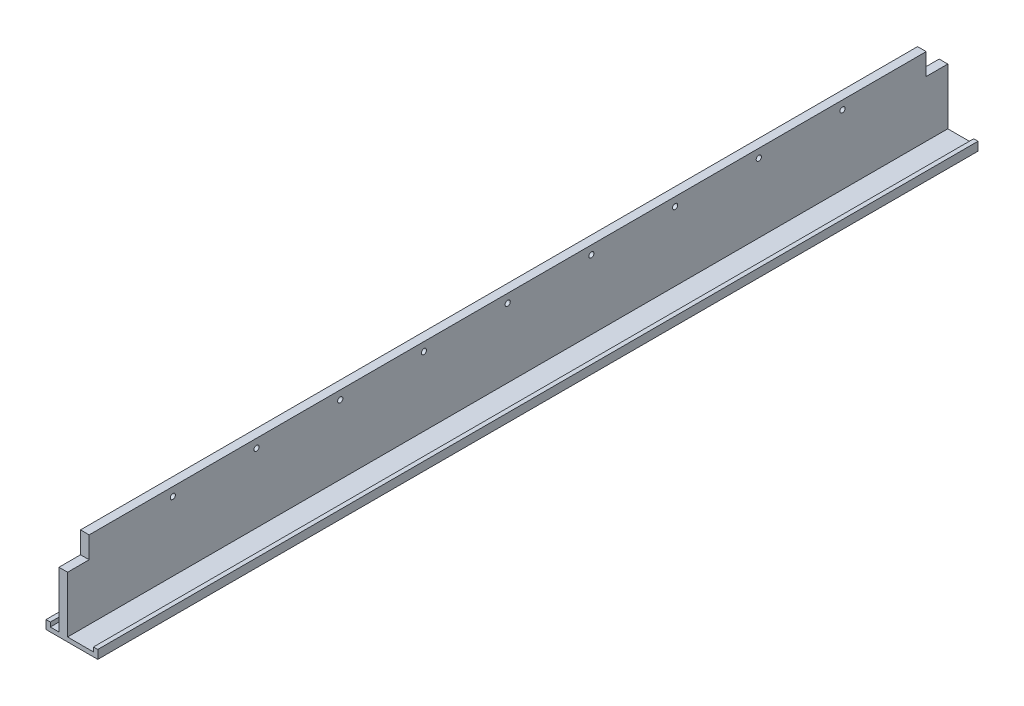
ISO-10303-21;
HEADER;
FILE_DESCRIPTION(('STEP AP214'),'2;1');
FILE_NAME('part.step','',(''),(''),'','','');
FILE_SCHEMA(('AUTOMOTIVE_DESIGN { 1 0 10303 214 1 1 1 1 }'));
ENDSEC;
DATA;
#1=APPLICATION_CONTEXT('core data for automotive mechanical design processes');
#2=APPLICATION_PROTOCOL_DEFINITION('international standard','automotive_design',2000,#1);
#3=PRODUCT_CONTEXT('',#1,'mechanical');
#4=PRODUCT('Part','Part','',(#3));
#5=PRODUCT_RELATED_PRODUCT_CATEGORY('part','',(#4));
#6=PRODUCT_DEFINITION_FORMATION('','',#4);
#7=PRODUCT_DEFINITION_CONTEXT('part definition',#1,'design');
#8=PRODUCT_DEFINITION('design','',#6,#7);
#9=PRODUCT_DEFINITION_SHAPE('','',#8);
#10=(LENGTH_UNIT() NAMED_UNIT(*) SI_UNIT(.MILLI.,.METRE.));
#11=(NAMED_UNIT(*) PLANE_ANGLE_UNIT() SI_UNIT($,.RADIAN.));
#12=(NAMED_UNIT(*) SI_UNIT($,.STERADIAN.) SOLID_ANGLE_UNIT());
#13=UNCERTAINTY_MEASURE_WITH_UNIT(LENGTH_MEASURE(1.E-05),#10,'distance_accuracy_value','');
#14=(GEOMETRIC_REPRESENTATION_CONTEXT(3) GLOBAL_UNCERTAINTY_ASSIGNED_CONTEXT((#13)) GLOBAL_UNIT_ASSIGNED_CONTEXT((#10,
#11,#12)) REPRESENTATION_CONTEXT('',''));
#15=CARTESIAN_POINT('',(0.,0.,0.));
#16=DIRECTION('',(0.,0.,1.));
#17=DIRECTION('',(1.,0.,0.));
#18=AXIS2_PLACEMENT_3D('',#15,#16,#17);
#19=CARTESIAN_POINT('',(5.,10.,1020.));
#20=DIRECTION('',(0.,-1.,0.));
#21=DIRECTION('',(1.,0.,0.));
#22=AXIS2_PLACEMENT_3D('',#19,#20,#21);
#23=PLANE('',#22);
#24=DIRECTION('',(-1.,0.,0.));
#25=VECTOR('',#24,1.);
#26=CARTESIAN_POINT('',(5.,10.,0.));
#27=LINE('',#26,#25);
#28=CARTESIAN_POINT('',(5.,10.,0.));
#29=VERTEX_POINT('',#28);
#30=CARTESIAN_POINT('',(0.,10.,0.));
#31=VERTEX_POINT('',#30);
#32=EDGE_CURVE('E376',#29,#31,#27,.T.);
#33=ORIENTED_EDGE('',*,*,#32,.T.);
#34=DIRECTION('',(0.,0.,-1.));
#35=VECTOR('',#34,1.);
#36=CARTESIAN_POINT('',(0.,10.,1020.));
#37=LINE('',#36,#35);
#38=CARTESIAN_POINT('',(0.,10.,1020.));
#39=VERTEX_POINT('',#38);
#40=EDGE_CURVE('E197',#39,#31,#37,.T.);
#41=ORIENTED_EDGE('',*,*,#40,.F.);
#42=DIRECTION('',(-1.,0.,0.));
#43=VECTOR('',#42,1.);
#44=CARTESIAN_POINT('',(5.,10.,1020.));
#45=LINE('',#44,#43);
#46=CARTESIAN_POINT('',(5.,10.,1020.));
#47=VERTEX_POINT('',#46);
#48=EDGE_CURVE('E380',#47,#39,#45,.T.);
#49=ORIENTED_EDGE('',*,*,#48,.F.);
#50=DIRECTION('',(0.,0.,-1.));
#51=VECTOR('',#50,1.);
#52=CARTESIAN_POINT('',(5.,10.,1020.));
#53=LINE('',#52,#51);
#54=EDGE_CURVE('E405',#47,#29,#53,.T.);
#55=ORIENTED_EDGE('',*,*,#54,.T.);
#56=EDGE_LOOP('',(#33,#41,#49,#55));
#57=FACE_BOUND('',#56,.T.);
#58=ADVANCED_FACE('F32',(#57),#23,.F.);
#59=CARTESIAN_POINT('',(0.,10.,1020.));
#60=DIRECTION('',(1.,0.,0.));
#61=DIRECTION('',(0.,1.,0.));
#62=AXIS2_PLACEMENT_3D('',#59,#60,#61);
#63=PLANE('',#62);
#64=DIRECTION('',(0.,-1.,0.));
#65=VECTOR('',#64,1.);
#66=CARTESIAN_POINT('',(0.,10.,0.));
#67=LINE('',#66,#65);
#68=CARTESIAN_POINT('',(0.,0.,0.));
#69=VERTEX_POINT('',#68);
#70=EDGE_CURVE('E407',#31,#69,#67,.T.);
#71=ORIENTED_EDGE('',*,*,#70,.T.);
#72=DIRECTION('',(0.,0.,-1.));
#73=VECTOR('',#72,1.);
#74=CARTESIAN_POINT('',(0.,0.,1020.));
#75=LINE('',#74,#73);
#76=CARTESIAN_POINT('',(0.,0.,1020.));
#77=VERTEX_POINT('',#76);
#78=EDGE_CURVE('E194',#77,#69,#75,.T.);
#79=ORIENTED_EDGE('',*,*,#78,.F.);
#80=DIRECTION('',(0.,-1.,0.));
#81=VECTOR('',#80,1.);
#82=CARTESIAN_POINT('',(0.,10.,1020.));
#83=LINE('',#82,#81);
#84=EDGE_CURVE('E383',#39,#77,#83,.T.);
#85=ORIENTED_EDGE('',*,*,#84,.F.);
#86=ORIENTED_EDGE('',*,*,#40,.T.);
#87=EDGE_LOOP('',(#71,#79,#85,#86));
#88=FACE_BOUND('',#87,.T.);
#89=ADVANCED_FACE('F260',(#88),#63,.F.);
#90=CARTESIAN_POINT('',(0.,0.,1020.));
#91=DIRECTION('',(0.,1.,0.));
#92=DIRECTION('',(0.,0.,1.));
#93=AXIS2_PLACEMENT_3D('',#90,#91,#92);
#94=PLANE('',#93);
#95=DIRECTION('',(1.,0.,0.));
#96=VECTOR('',#95,1.);
#97=CARTESIAN_POINT('',(0.,0.,0.));
#98=LINE('',#97,#96);
#99=CARTESIAN_POINT('',(60.,0.,0.));
#100=VERTEX_POINT('',#99);
#101=EDGE_CURVE('E409',#69,#100,#98,.T.);
#102=ORIENTED_EDGE('',*,*,#101,.T.);
#103=DIRECTION('',(0.,0.,-1.));
#104=VECTOR('',#103,1.);
#105=CARTESIAN_POINT('',(60.,0.,1020.));
#106=LINE('',#105,#104);
#107=CARTESIAN_POINT('',(60.,0.,1020.));
#108=VERTEX_POINT('',#107);
#109=EDGE_CURVE('E191',#108,#100,#106,.T.);
#110=ORIENTED_EDGE('',*,*,#109,.F.);
#111=DIRECTION('',(1.,0.,0.));
#112=VECTOR('',#111,1.);
#113=CARTESIAN_POINT('',(0.,0.,1020.));
#114=LINE('',#113,#112);
#115=EDGE_CURVE('E386',#77,#108,#114,.T.);
#116=ORIENTED_EDGE('',*,*,#115,.F.);
#117=ORIENTED_EDGE('',*,*,#78,.T.);
#118=EDGE_LOOP('',(#102,#110,#116,#117));
#119=FACE_BOUND('',#118,.T.);
#120=ADVANCED_FACE('F266',(#119),#94,.F.);
#121=CARTESIAN_POINT('',(60.,0.,1020.));
#122=DIRECTION('',(-1.,0.,0.));
#123=DIRECTION('',(0.,0.,1.));
#124=AXIS2_PLACEMENT_3D('',#121,#122,#123);
#125=PLANE('',#124);
#126=DIRECTION('',(0.,1.,0.));
#127=VECTOR('',#126,1.);
#128=CARTESIAN_POINT('',(60.,0.,0.));
#129=LINE('',#128,#127);
#130=CARTESIAN_POINT('',(60.,10.,0.));
#131=VERTEX_POINT('',#130);
#132=EDGE_CURVE('E411',#100,#131,#129,.T.);
#133=ORIENTED_EDGE('',*,*,#132,.T.);
#134=DIRECTION('',(0.,0.,-1.));
#135=VECTOR('',#134,1.);
#136=CARTESIAN_POINT('',(60.,10.,1020.));
#137=LINE('',#136,#135);
#138=CARTESIAN_POINT('',(60.,10.,1020.));
#139=VERTEX_POINT('',#138);
#140=EDGE_CURVE('E188',#139,#131,#137,.T.);
#141=ORIENTED_EDGE('',*,*,#140,.F.);
#142=DIRECTION('',(0.,1.,0.));
#143=VECTOR('',#142,1.);
#144=CARTESIAN_POINT('',(60.,0.,1020.));
#145=LINE('',#144,#143);
#146=EDGE_CURVE('E388',#108,#139,#145,.T.);
#147=ORIENTED_EDGE('',*,*,#146,.F.);
#148=ORIENTED_EDGE('',*,*,#109,.T.);
#149=EDGE_LOOP('',(#133,#141,#147,#148));
#150=FACE_BOUND('',#149,.T.);
#151=ADVANCED_FACE('F464',(#150),#125,.F.);
#152=CARTESIAN_POINT('',(60.,10.,1020.));
#153=DIRECTION('',(0.,-1.,0.));
#154=DIRECTION('',(0.,0.,-1.));
#155=AXIS2_PLACEMENT_3D('',#152,#153,#154);
#156=PLANE('',#155);
#157=DIRECTION('',(-1.,0.,0.));
#158=VECTOR('',#157,1.);
#159=CARTESIAN_POINT('',(60.,10.,0.));
#160=LINE('',#159,#158);
#161=CARTESIAN_POINT('',(55.,10.,0.));
#162=VERTEX_POINT('',#161);
#163=EDGE_CURVE('E413',#131,#162,#160,.T.);
#164=ORIENTED_EDGE('',*,*,#163,.T.);
#165=DIRECTION('',(0.,0.,-1.));
#166=VECTOR('',#165,1.);
#167=CARTESIAN_POINT('',(55.,10.,1020.));
#168=LINE('',#167,#166);
#169=CARTESIAN_POINT('',(55.,10.,1020.));
#170=VERTEX_POINT('',#169);
#171=EDGE_CURVE('E185',#170,#162,#168,.T.);
#172=ORIENTED_EDGE('',*,*,#171,.F.);
#173=DIRECTION('',(-1.,0.,0.));
#174=VECTOR('',#173,1.);
#175=CARTESIAN_POINT('',(60.,10.,1020.));
#176=LINE('',#175,#174);
#177=EDGE_CURVE('E390',#139,#170,#176,.T.);
#178=ORIENTED_EDGE('',*,*,#177,.F.);
#179=ORIENTED_EDGE('',*,*,#140,.T.);
#180=EDGE_LOOP('',(#164,#172,#178,#179));
#181=FACE_BOUND('',#180,.T.);
#182=ADVANCED_FACE('F460',(#181),#156,.F.);
#183=CARTESIAN_POINT('',(55.,10.,1020.));
#184=DIRECTION('',(1.,0.,0.));
#185=DIRECTION('',(0.,0.,-1.));
#186=AXIS2_PLACEMENT_3D('',#183,#184,#185);
#187=PLANE('',#186);
#188=DIRECTION('',(0.,-1.,0.));
#189=VECTOR('',#188,1.);
#190=CARTESIAN_POINT('',(55.,10.,0.));
#191=LINE('',#190,#189);
#192=CARTESIAN_POINT('',(55.,5.00000000000001,0.));
#193=VERTEX_POINT('',#192);
#194=EDGE_CURVE('E415',#162,#193,#191,.T.);
#195=ORIENTED_EDGE('',*,*,#194,.T.);
#196=DIRECTION('',(0.,0.,-1.));
#197=VECTOR('',#196,1.);
#198=CARTESIAN_POINT('',(55.,5.00000000000001,1020.));
#199=LINE('',#198,#197);
#200=CARTESIAN_POINT('',(55.,5.00000000000001,1020.));
#201=VERTEX_POINT('',#200);
#202=EDGE_CURVE('E182',#201,#193,#199,.T.);
#203=ORIENTED_EDGE('',*,*,#202,.F.);
#204=DIRECTION('',(0.,-1.,0.));
#205=VECTOR('',#204,1.);
#206=CARTESIAN_POINT('',(55.,10.,1020.));
#207=LINE('',#206,#205);
#208=EDGE_CURVE('E392',#170,#201,#207,.T.);
#209=ORIENTED_EDGE('',*,*,#208,.F.);
#210=ORIENTED_EDGE('',*,*,#171,.T.);
#211=EDGE_LOOP('',(#195,#203,#209,#210));
#212=FACE_BOUND('',#211,.T.);
#213=ADVANCED_FACE('F254',(#212),#187,.F.);
#214=CARTESIAN_POINT('',(55.,5.00000000000001,1020.));
#215=DIRECTION('',(0.,-1.,0.));
#216=DIRECTION('',(1.,0.,0.));
#217=AXIS2_PLACEMENT_3D('',#214,#215,#216);
#218=PLANE('',#217);
#219=DIRECTION('',(-1.,0.,0.));
#220=VECTOR('',#219,1.);
#221=CARTESIAN_POINT('',(55.,5.00000000000001,0.));
#222=LINE('',#221,#220);
#223=CARTESIAN_POINT('',(25.,5.,0.));
#224=VERTEX_POINT('',#223);
#225=EDGE_CURVE('E417',#193,#224,#222,.T.);
#226=ORIENTED_EDGE('',*,*,#225,.T.);
#227=DIRECTION('',(0.,0.,-1.));
#228=VECTOR('',#227,1.);
#229=CARTESIAN_POINT('',(25.,5.,1020.));
#230=LINE('',#229,#228);
#231=CARTESIAN_POINT('',(25.,5.,1020.));
#232=VERTEX_POINT('',#231);
#233=EDGE_CURVE('E173',#232,#224,#230,.T.);
#234=ORIENTED_EDGE('',*,*,#233,.F.);
#235=DIRECTION('',(-1.,0.,0.));
#236=VECTOR('',#235,1.);
#237=CARTESIAN_POINT('',(55.,5.00000000000001,1020.));
#238=LINE('',#237,#236);
#239=EDGE_CURVE('E394',#201,#232,#238,.T.);
#240=ORIENTED_EDGE('',*,*,#239,.F.);
#241=ORIENTED_EDGE('',*,*,#202,.T.);
#242=EDGE_LOOP('',(#226,#234,#240,#241));
#243=FACE_BOUND('',#242,.T.);
#244=ADVANCED_FACE('F246',(#243),#218,.F.);
#245=CARTESIAN_POINT('',(25.,5.,1020.));
#246=DIRECTION('',(-1.,0.,0.));
#247=DIRECTION('',(0.,0.,1.));
#248=AXIS2_PLACEMENT_3D('',#245,#246,#247);
#249=PLANE('',#248);
#250=CARTESIAN_POINT('',(25.,85.,801.));
#251=DIRECTION('',(1.,0.,0.));
#252=DIRECTION('',(0.,1.,0.));
#253=AXIS2_PLACEMENT_3D('',#250,#251,#252);
#254=CIRCLE('',#253,3.00000000000005);
#255=CARTESIAN_POINT('',(25.,88.0000000000001,801.));
#256=VERTEX_POINT('',#255);
#257=EDGE_CURVE('E349',#256,#256,#254,.T.);
#258=ORIENTED_EDGE('',*,*,#257,.F.);
#259=EDGE_LOOP('',(#258));
#260=FACE_BOUND('',#259,.T.);
#261=CARTESIAN_POINT('',(25.,85.,898.));
#262=DIRECTION('',(1.,0.,0.));
#263=DIRECTION('',(0.,1.,0.));
#264=AXIS2_PLACEMENT_3D('',#261,#262,#263);
#265=CIRCLE('',#264,3.00000000000005);
#266=CARTESIAN_POINT('',(25.,88.0000000000001,898.));
#267=VERTEX_POINT('',#266);
#268=EDGE_CURVE('E350',#267,#267,#265,.T.);
#269=ORIENTED_EDGE('',*,*,#268,.F.);
#270=EDGE_LOOP('',(#269));
#271=FACE_BOUND('',#270,.T.);
#272=DIRECTION('',(0.,1.,0.));
#273=VECTOR('',#272,1.);
#274=CARTESIAN_POINT('',(25.,5.,0.));
#275=LINE('',#274,#273);
#276=CARTESIAN_POINT('',(25.,70.,0.));
#277=VERTEX_POINT('',#276);
#278=EDGE_CURVE('E419',#224,#277,#275,.T.);
#279=ORIENTED_EDGE('',*,*,#278,.T.);
#280=DIRECTION('',(0.,0.,-1.));
#281=VECTOR('',#280,1.);
#282=CARTESIAN_POINT('',(25.,70.,0.));
#283=LINE('',#282,#281);
#284=CARTESIAN_POINT('',(25.,70.,25.));
#285=VERTEX_POINT('',#284);
#286=EDGE_CURVE('E47',#285,#277,#283,.T.);
#287=ORIENTED_EDGE('',*,*,#286,.F.);
#288=DIRECTION('',(0.,-1.,0.));
#289=VECTOR('',#288,1.);
#290=CARTESIAN_POINT('',(25.,95.,25.));
#291=LINE('',#290,#289);
#292=CARTESIAN_POINT('',(25.,95.,25.));
#293=VERTEX_POINT('',#292);
#294=EDGE_CURVE('E358',#293,#285,#291,.T.);
#295=ORIENTED_EDGE('',*,*,#294,.F.);
#296=DIRECTION('',(0.,0.,-1.));
#297=VECTOR('',#296,1.);
#298=CARTESIAN_POINT('',(25.,95.,1020.));
#299=LINE('',#298,#297);
#300=CARTESIAN_POINT('',(25.,95.,995.));
#301=VERTEX_POINT('',#300);
#302=EDGE_CURVE('E164',#301,#293,#299,.T.);
#303=ORIENTED_EDGE('',*,*,#302,.F.);
#304=DIRECTION('',(0.,1.,0.));
#305=VECTOR('',#304,1.);
#306=CARTESIAN_POINT('',(25.,95.,995.));
#307=LINE('',#306,#305);
#308=CARTESIAN_POINT('',(25.,70.,995.));
#309=VERTEX_POINT('',#308);
#310=EDGE_CURVE('E368',#309,#301,#307,.T.);
#311=ORIENTED_EDGE('',*,*,#310,.F.);
#312=DIRECTION('',(0.,0.,-1.));
#313=VECTOR('',#312,1.);
#314=CARTESIAN_POINT('',(25.,70.,1020.));
#315=LINE('',#314,#313);
#316=CARTESIAN_POINT('',(25.,70.,1020.));
#317=VERTEX_POINT('',#316);
#318=EDGE_CURVE('E365',#317,#309,#315,.T.);
#319=ORIENTED_EDGE('',*,*,#318,.F.);
#320=DIRECTION('',(0.,1.,0.));
#321=VECTOR('',#320,1.);
#322=CARTESIAN_POINT('',(25.,5.,1020.));
#323=LINE('',#322,#321);
#324=EDGE_CURVE('E396',#232,#317,#323,.T.);
#325=ORIENTED_EDGE('',*,*,#324,.F.);
#326=ORIENTED_EDGE('',*,*,#233,.T.);
#327=EDGE_LOOP('',(#279,#287,#295,#303,#311,#319,#325,#326));
#328=FACE_BOUND('',#327,.T.);
#329=CARTESIAN_POINT('',(25.,85.,704.));
#330=DIRECTION('',(1.,0.,0.));
#331=DIRECTION('',(0.,1.,0.));
#332=AXIS2_PLACEMENT_3D('',#329,#330,#331);
#333=CIRCLE('',#332,3.00000000000005);
#334=CARTESIAN_POINT('',(25.,88.0000000000001,704.));
#335=VERTEX_POINT('',#334);
#336=EDGE_CURVE('E203',#335,#335,#333,.T.);
#337=ORIENTED_EDGE('',*,*,#336,.F.);
#338=EDGE_LOOP('',(#337));
#339=FACE_BOUND('',#338,.T.);
#340=CARTESIAN_POINT('',(25.,85.,607.));
#341=DIRECTION('',(1.,0.,0.));
#342=DIRECTION('',(0.,1.,0.));
#343=AXIS2_PLACEMENT_3D('',#340,#341,#342);
#344=CIRCLE('',#343,3.00000000000005);
#345=CARTESIAN_POINT('',(25.,88.0000000000001,607.));
#346=VERTEX_POINT('',#345);
#347=EDGE_CURVE('E209',#346,#346,#344,.T.);
#348=ORIENTED_EDGE('',*,*,#347,.F.);
#349=EDGE_LOOP('',(#348));
#350=FACE_BOUND('',#349,.T.);
#351=CARTESIAN_POINT('',(25.,85.,510.));
#352=DIRECTION('',(1.,0.,0.));
#353=DIRECTION('',(0.,1.,0.));
#354=AXIS2_PLACEMENT_3D('',#351,#352,#353);
#355=CIRCLE('',#354,3.00000000000005);
#356=CARTESIAN_POINT('',(25.,88.0000000000001,510.));
#357=VERTEX_POINT('',#356);
#358=EDGE_CURVE('E215',#357,#357,#355,.T.);
#359=ORIENTED_EDGE('',*,*,#358,.F.);
#360=EDGE_LOOP('',(#359));
#361=FACE_BOUND('',#360,.T.);
#362=CARTESIAN_POINT('',(25.,85.,413.));
#363=DIRECTION('',(1.,0.,0.));
#364=DIRECTION('',(0.,1.,0.));
#365=AXIS2_PLACEMENT_3D('',#362,#363,#364);
#366=CIRCLE('',#365,3.00000000000005);
#367=CARTESIAN_POINT('',(25.,88.0000000000001,413.));
#368=VERTEX_POINT('',#367);
#369=EDGE_CURVE('E221',#368,#368,#366,.T.);
#370=ORIENTED_EDGE('',*,*,#369,.F.);
#371=EDGE_LOOP('',(#370));
#372=FACE_BOUND('',#371,.T.);
#373=CARTESIAN_POINT('',(25.,85.,316.));
#374=DIRECTION('',(1.,0.,0.));
#375=DIRECTION('',(0.,1.,0.));
#376=AXIS2_PLACEMENT_3D('',#373,#374,#375);
#377=CIRCLE('',#376,3.00000000000005);
#378=CARTESIAN_POINT('',(25.,88.0000000000001,316.));
#379=VERTEX_POINT('',#378);
#380=EDGE_CURVE('E227',#379,#379,#377,.T.);
#381=ORIENTED_EDGE('',*,*,#380,.F.);
#382=EDGE_LOOP('',(#381));
#383=FACE_BOUND('',#382,.T.);
#384=CARTESIAN_POINT('',(25.,85.,219.));
#385=DIRECTION('',(1.,0.,0.));
#386=DIRECTION('',(0.,1.,0.));
#387=AXIS2_PLACEMENT_3D('',#384,#385,#386);
#388=CIRCLE('',#387,3.00000000000005);
#389=CARTESIAN_POINT('',(25.,88.0000000000001,219.));
#390=VERTEX_POINT('',#389);
#391=EDGE_CURVE('E233',#390,#390,#388,.T.);
#392=ORIENTED_EDGE('',*,*,#391,.F.);
#393=EDGE_LOOP('',(#392));
#394=FACE_BOUND('',#393,.T.);
#395=CARTESIAN_POINT('',(25.,85.,122.));
#396=DIRECTION('',(1.,0.,0.));
#397=DIRECTION('',(0.,1.,0.));
#398=AXIS2_PLACEMENT_3D('',#395,#396,#397);
#399=CIRCLE('',#398,3.00000000000005);
#400=CARTESIAN_POINT('',(25.,88.0000000000001,122.));
#401=VERTEX_POINT('',#400);
#402=EDGE_CURVE('E11',#401,#401,#399,.T.);
#403=ORIENTED_EDGE('',*,*,#402,.F.);
#404=EDGE_LOOP('',(#403));
#405=FACE_BOUND('',#404,.T.);
#406=ADVANCED_FACE('F244',(#260,#271,#328,#339,#350,#361,#372,#383,#394,#405),#249,.F.);
#407=CARTESIAN_POINT('',(25.,95.,1020.));
#408=DIRECTION('',(0.,-1.,0.));
#409=DIRECTION('',(0.,0.,-1.));
#410=AXIS2_PLACEMENT_3D('',#407,#408,#409);
#411=PLANE('',#410);
#412=ORIENTED_EDGE('',*,*,#302,.T.);
#413=DIRECTION('',(1.,0.,0.));
#414=VECTOR('',#413,1.);
#415=CARTESIAN_POINT('',(15.,95.,25.));
#416=LINE('',#415,#414);
#417=CARTESIAN_POINT('',(15.,95.,25.));
#418=VERTEX_POINT('',#417);
#419=EDGE_CURVE('E148',#418,#293,#416,.T.);
#420=ORIENTED_EDGE('',*,*,#419,.F.);
#421=DIRECTION('',(0.,0.,-1.));
#422=VECTOR('',#421,1.);
#423=CARTESIAN_POINT('',(15.,95.,1020.));
#424=LINE('',#423,#422);
#425=CARTESIAN_POINT('',(15.,95.,995.));
#426=VERTEX_POINT('',#425);
#427=EDGE_CURVE('E162',#426,#418,#424,.T.);
#428=ORIENTED_EDGE('',*,*,#427,.F.);
#429=DIRECTION('',(1.,0.,0.));
#430=VECTOR('',#429,1.);
#431=CARTESIAN_POINT('',(15.,95.,995.));
#432=LINE('',#431,#430);
#433=EDGE_CURVE('E374',#426,#301,#432,.T.);
#434=ORIENTED_EDGE('',*,*,#433,.T.);
#435=EDGE_LOOP('',(#412,#420,#428,#434));
#436=FACE_BOUND('',#435,.T.);
#437=ADVANCED_FACE('F160',(#436),#411,.F.);
#438=CARTESIAN_POINT('',(15.,95.,1020.));
#439=DIRECTION('',(1.,0.,0.));
#440=DIRECTION('',(0.,1.,0.));
#441=AXIS2_PLACEMENT_3D('',#438,#439,#440);
#442=PLANE('',#441);
#443=CARTESIAN_POINT('',(15.,85.,801.));
#444=DIRECTION('',(1.,0.,0.));
#445=DIRECTION('',(0.,1.,0.));
#446=AXIS2_PLACEMENT_3D('',#443,#444,#445);
#447=CIRCLE('',#446,3.00000000000005);
#448=CARTESIAN_POINT('',(15.,88.0000000000001,801.));
#449=VERTEX_POINT('',#448);
#450=EDGE_CURVE('E347',#449,#449,#447,.T.);
#451=ORIENTED_EDGE('',*,*,#450,.T.);
#452=EDGE_LOOP('',(#451));
#453=FACE_BOUND('',#452,.T.);
#454=CARTESIAN_POINT('',(15.,85.,898.));
#455=DIRECTION('',(1.,0.,0.));
#456=DIRECTION('',(0.,1.,0.));
#457=AXIS2_PLACEMENT_3D('',#454,#455,#456);
#458=CIRCLE('',#457,3.00000000000005);
#459=CARTESIAN_POINT('',(15.,88.0000000000001,898.));
#460=VERTEX_POINT('',#459);
#461=EDGE_CURVE('E353',#460,#460,#458,.T.);
#462=ORIENTED_EDGE('',*,*,#461,.T.);
#463=EDGE_LOOP('',(#462));
#464=FACE_BOUND('',#463,.T.);
#465=DIRECTION('',(0.,-1.,0.));
#466=VECTOR('',#465,1.);
#467=CARTESIAN_POINT('',(15.,95.,25.));
#468=LINE('',#467,#466);
#469=CARTESIAN_POINT('',(15.,70.,25.));
#470=VERTEX_POINT('',#469);
#471=EDGE_CURVE('E144',#418,#470,#468,.T.);
#472=ORIENTED_EDGE('',*,*,#471,.T.);
#473=DIRECTION('',(0.,0.,-1.));
#474=VECTOR('',#473,1.);
#475=CARTESIAN_POINT('',(15.,70.,0.));
#476=LINE('',#475,#474);
#477=CARTESIAN_POINT('',(15.,70.,0.));
#478=VERTEX_POINT('',#477);
#479=EDGE_CURVE('E155',#470,#478,#476,.T.);
#480=ORIENTED_EDGE('',*,*,#479,.T.);
#481=DIRECTION('',(0.,-1.,0.));
#482=VECTOR('',#481,1.);
#483=CARTESIAN_POINT('',(15.,95.,0.));
#484=LINE('',#483,#482);
#485=CARTESIAN_POINT('',(15.,5.,0.));
#486=VERTEX_POINT('',#485);
#487=EDGE_CURVE('E422',#478,#486,#484,.T.);
#488=ORIENTED_EDGE('',*,*,#487,.T.);
#489=DIRECTION('',(0.,0.,-1.));
#490=VECTOR('',#489,1.);
#491=CARTESIAN_POINT('',(15.,5.,1020.));
#492=LINE('',#491,#490);
#493=CARTESIAN_POINT('',(15.,5.,1020.));
#494=VERTEX_POINT('',#493);
#495=EDGE_CURVE('E171',#494,#486,#492,.T.);
#496=ORIENTED_EDGE('',*,*,#495,.F.);
#497=DIRECTION('',(0.,-1.,0.));
#498=VECTOR('',#497,1.);
#499=CARTESIAN_POINT('',(15.,95.,1020.));
#500=LINE('',#499,#498);
#501=CARTESIAN_POINT('',(15.,70.,1020.));
#502=VERTEX_POINT('',#501);
#503=EDGE_CURVE('E399',#502,#494,#500,.T.);
#504=ORIENTED_EDGE('',*,*,#503,.F.);
#505=DIRECTION('',(0.,0.,-1.));
#506=VECTOR('',#505,1.);
#507=CARTESIAN_POINT('',(15.,70.,1020.));
#508=LINE('',#507,#506);
#509=CARTESIAN_POINT('',(15.,70.,995.));
#510=VERTEX_POINT('',#509);
#511=EDGE_CURVE('E55',#502,#510,#508,.T.);
#512=ORIENTED_EDGE('',*,*,#511,.T.);
#513=DIRECTION('',(0.,1.,0.));
#514=VECTOR('',#513,1.);
#515=CARTESIAN_POINT('',(15.,95.,995.));
#516=LINE('',#515,#514);
#517=EDGE_CURVE('E170',#510,#426,#516,.T.);
#518=ORIENTED_EDGE('',*,*,#517,.T.);
#519=ORIENTED_EDGE('',*,*,#427,.T.);
#520=EDGE_LOOP('',(#472,#480,#488,#496,#504,#512,#518,#519));
#521=FACE_BOUND('',#520,.T.);
#522=CARTESIAN_POINT('',(15.,85.,704.));
#523=DIRECTION('',(1.,0.,0.));
#524=DIRECTION('',(0.,1.,0.));
#525=AXIS2_PLACEMENT_3D('',#522,#523,#524);
#526=CIRCLE('',#525,3.00000000000005);
#527=CARTESIAN_POINT('',(15.,88.0000000000001,704.));
#528=VERTEX_POINT('',#527);
#529=EDGE_CURVE('E200',#528,#528,#526,.T.);
#530=ORIENTED_EDGE('',*,*,#529,.T.);
#531=EDGE_LOOP('',(#530));
#532=FACE_BOUND('',#531,.T.);
#533=CARTESIAN_POINT('',(15.,85.,607.));
#534=DIRECTION('',(1.,0.,0.));
#535=DIRECTION('',(0.,1.,0.));
#536=AXIS2_PLACEMENT_3D('',#533,#534,#535);
#537=CIRCLE('',#536,3.00000000000005);
#538=CARTESIAN_POINT('',(15.,88.0000000000001,607.));
#539=VERTEX_POINT('',#538);
#540=EDGE_CURVE('E206',#539,#539,#537,.T.);
#541=ORIENTED_EDGE('',*,*,#540,.T.);
#542=EDGE_LOOP('',(#541));
#543=FACE_BOUND('',#542,.T.);
#544=CARTESIAN_POINT('',(15.,85.,510.));
#545=DIRECTION('',(1.,0.,0.));
#546=DIRECTION('',(0.,1.,0.));
#547=AXIS2_PLACEMENT_3D('',#544,#545,#546);
#548=CIRCLE('',#547,3.00000000000005);
#549=CARTESIAN_POINT('',(15.,88.0000000000001,510.));
#550=VERTEX_POINT('',#549);
#551=EDGE_CURVE('E212',#550,#550,#548,.T.);
#552=ORIENTED_EDGE('',*,*,#551,.T.);
#553=EDGE_LOOP('',(#552));
#554=FACE_BOUND('',#553,.T.);
#555=CARTESIAN_POINT('',(15.,85.,413.));
#556=DIRECTION('',(1.,0.,0.));
#557=DIRECTION('',(0.,1.,0.));
#558=AXIS2_PLACEMENT_3D('',#555,#556,#557);
#559=CIRCLE('',#558,3.00000000000005);
#560=CARTESIAN_POINT('',(15.,88.0000000000001,413.));
#561=VERTEX_POINT('',#560);
#562=EDGE_CURVE('E218',#561,#561,#559,.T.);
#563=ORIENTED_EDGE('',*,*,#562,.T.);
#564=EDGE_LOOP('',(#563));
#565=FACE_BOUND('',#564,.T.);
#566=CARTESIAN_POINT('',(15.,85.,316.));
#567=DIRECTION('',(1.,0.,0.));
#568=DIRECTION('',(0.,1.,0.));
#569=AXIS2_PLACEMENT_3D('',#566,#567,#568);
#570=CIRCLE('',#569,3.00000000000005);
#571=CARTESIAN_POINT('',(15.,88.0000000000001,316.));
#572=VERTEX_POINT('',#571);
#573=EDGE_CURVE('E224',#572,#572,#570,.T.);
#574=ORIENTED_EDGE('',*,*,#573,.T.);
#575=EDGE_LOOP('',(#574));
#576=FACE_BOUND('',#575,.T.);
#577=CARTESIAN_POINT('',(15.,85.,219.));
#578=DIRECTION('',(1.,0.,0.));
#579=DIRECTION('',(0.,1.,0.));
#580=AXIS2_PLACEMENT_3D('',#577,#578,#579);
#581=CIRCLE('',#580,3.00000000000005);
#582=CARTESIAN_POINT('',(15.,88.0000000000001,219.));
#583=VERTEX_POINT('',#582);
#584=EDGE_CURVE('E230',#583,#583,#581,.T.);
#585=ORIENTED_EDGE('',*,*,#584,.T.);
#586=EDGE_LOOP('',(#585));
#587=FACE_BOUND('',#586,.T.);
#588=CARTESIAN_POINT('',(15.,85.,122.));
#589=DIRECTION('',(1.,0.,0.));
#590=DIRECTION('',(0.,1.,0.));
#591=AXIS2_PLACEMENT_3D('',#588,#589,#590);
#592=CIRCLE('',#591,3.00000000000005);
#593=CARTESIAN_POINT('',(15.,88.0000000000001,122.));
#594=VERTEX_POINT('',#593);
#595=EDGE_CURVE('E40',#594,#594,#592,.T.);
#596=ORIENTED_EDGE('',*,*,#595,.T.);
#597=EDGE_LOOP('',(#596));
#598=FACE_BOUND('',#597,.T.);
#599=ADVANCED_FACE('F167',(#453,#464,#521,#532,#543,#554,#565,#576,#587,#598),#442,.F.);
#600=CARTESIAN_POINT('',(15.,5.,1020.));
#601=DIRECTION('',(0.,-1.,0.));
#602=DIRECTION('',(1.,0.,0.));
#603=AXIS2_PLACEMENT_3D('',#600,#601,#602);
#604=PLANE('',#603);
#605=DIRECTION('',(-1.,0.,0.));
#606=VECTOR('',#605,1.);
#607=CARTESIAN_POINT('',(15.,5.,0.));
#608=LINE('',#607,#606);
#609=CARTESIAN_POINT('',(5.,5.,0.));
#610=VERTEX_POINT('',#609);
#611=EDGE_CURVE('E424',#486,#610,#608,.T.);
#612=ORIENTED_EDGE('',*,*,#611,.T.);
#613=DIRECTION('',(0.,0.,-1.));
#614=VECTOR('',#613,1.);
#615=CARTESIAN_POINT('',(5.,5.,1020.));
#616=LINE('',#615,#614);
#617=CARTESIAN_POINT('',(5.,5.,1020.));
#618=VERTEX_POINT('',#617);
#619=EDGE_CURVE('E176',#618,#610,#616,.T.);
#620=ORIENTED_EDGE('',*,*,#619,.F.);
#621=DIRECTION('',(-1.,0.,0.));
#622=VECTOR('',#621,1.);
#623=CARTESIAN_POINT('',(15.,5.,1020.));
#624=LINE('',#623,#622);
#625=EDGE_CURVE('E401',#494,#618,#624,.T.);
#626=ORIENTED_EDGE('',*,*,#625,.F.);
#627=ORIENTED_EDGE('',*,*,#495,.T.);
#628=EDGE_LOOP('',(#612,#620,#626,#627));
#629=FACE_BOUND('',#628,.T.);
#630=ADVANCED_FACE('F302',(#629),#604,.F.);
#631=CARTESIAN_POINT('',(5.,5.,1020.));
#632=DIRECTION('',(-1.,0.,0.));
#633=DIRECTION('',(0.,0.,1.));
#634=AXIS2_PLACEMENT_3D('',#631,#632,#633);
#635=PLANE('',#634);
#636=DIRECTION('',(0.,1.,0.));
#637=VECTOR('',#636,1.);
#638=CARTESIAN_POINT('',(5.,5.,0.));
#639=LINE('',#638,#637);
#640=EDGE_CURVE('E384',#610,#29,#639,.T.);
#641=ORIENTED_EDGE('',*,*,#640,.T.);
#642=ORIENTED_EDGE('',*,*,#54,.F.);
#643=DIRECTION('',(0.,1.,0.));
#644=VECTOR('',#643,1.);
#645=CARTESIAN_POINT('',(5.,5.,1020.));
#646=LINE('',#645,#644);
#647=EDGE_CURVE('E403',#618,#47,#646,.T.);
#648=ORIENTED_EDGE('',*,*,#647,.F.);
#649=ORIENTED_EDGE('',*,*,#619,.T.);
#650=EDGE_LOOP('',(#641,#642,#648,#649));
#651=FACE_BOUND('',#650,.T.);
#652=ADVANCED_FACE('F308',(#651),#635,.F.);
#653=CARTESIAN_POINT('',(0.,0.,1020.));
#654=DIRECTION('',(0.,0.,1.));
#655=DIRECTION('',(1.,0.,0.));
#656=AXIS2_PLACEMENT_3D('',#653,#654,#655);
#657=PLANE('',#656);
#658=DIRECTION('',(1.,0.,0.));
#659=VECTOR('',#658,1.);
#660=CARTESIAN_POINT('',(15.,70.,1020.));
#661=LINE('',#660,#659);
#662=EDGE_CURVE('E370',#502,#317,#661,.T.);
#663=ORIENTED_EDGE('',*,*,#662,.F.);
#664=ORIENTED_EDGE('',*,*,#503,.T.);
#665=ORIENTED_EDGE('',*,*,#625,.T.);
#666=ORIENTED_EDGE('',*,*,#647,.T.);
#667=ORIENTED_EDGE('',*,*,#48,.T.);
#668=ORIENTED_EDGE('',*,*,#84,.T.);
#669=ORIENTED_EDGE('',*,*,#115,.T.);
#670=ORIENTED_EDGE('',*,*,#146,.T.);
#671=ORIENTED_EDGE('',*,*,#177,.T.);
#672=ORIENTED_EDGE('',*,*,#208,.T.);
#673=ORIENTED_EDGE('',*,*,#239,.T.);
#674=ORIENTED_EDGE('',*,*,#324,.T.);
#675=EDGE_LOOP('',(#663,#664,#665,#666,#667,#668,#669,#670,#671,#672,#673,#674));
#676=FACE_BOUND('',#675,.T.);
#677=ADVANCED_FACE('F316',(#676),#657,.T.);
#678=CARTESIAN_POINT('',(0.,0.,0.));
#679=DIRECTION('',(0.,0.,1.));
#680=DIRECTION('',(1.,0.,0.));
#681=AXIS2_PLACEMENT_3D('',#678,#679,#680);
#682=PLANE('',#681);
#683=ORIENTED_EDGE('',*,*,#487,.F.);
#684=DIRECTION('',(1.,0.,0.));
#685=VECTOR('',#684,1.);
#686=CARTESIAN_POINT('',(15.,70.,0.));
#687=LINE('',#686,#685);
#688=EDGE_CURVE('E363',#478,#277,#687,.T.);
#689=ORIENTED_EDGE('',*,*,#688,.T.);
#690=ORIENTED_EDGE('',*,*,#278,.F.);
#691=ORIENTED_EDGE('',*,*,#225,.F.);
#692=ORIENTED_EDGE('',*,*,#194,.F.);
#693=ORIENTED_EDGE('',*,*,#163,.F.);
#694=ORIENTED_EDGE('',*,*,#132,.F.);
#695=ORIENTED_EDGE('',*,*,#101,.F.);
#696=ORIENTED_EDGE('',*,*,#70,.F.);
#697=ORIENTED_EDGE('',*,*,#32,.F.);
#698=ORIENTED_EDGE('',*,*,#640,.F.);
#699=ORIENTED_EDGE('',*,*,#611,.F.);
#700=EDGE_LOOP('',(#683,#689,#690,#691,#692,#693,#694,#695,#696,#697,#698,#699));
#701=FACE_BOUND('',#700,.T.);
#702=ADVANCED_FACE('F318',(#701),#682,.F.);
#703=CARTESIAN_POINT('',(15.,95.,995.));
#704=DIRECTION('',(0.,0.,-1.));
#705=DIRECTION('',(-1.,0.,0.));
#706=AXIS2_PLACEMENT_3D('',#703,#704,#705);
#707=PLANE('',#706);
#708=ORIENTED_EDGE('',*,*,#310,.T.);
#709=ORIENTED_EDGE('',*,*,#433,.F.);
#710=ORIENTED_EDGE('',*,*,#517,.F.);
#711=DIRECTION('',(1.,0.,0.));
#712=VECTOR('',#711,1.);
#713=CARTESIAN_POINT('',(15.,70.,995.));
#714=LINE('',#713,#712);
#715=EDGE_CURVE('E377',#510,#309,#714,.T.);
#716=ORIENTED_EDGE('',*,*,#715,.T.);
#717=EDGE_LOOP('',(#708,#709,#710,#716));
#718=FACE_BOUND('',#717,.T.);
#719=ADVANCED_FACE('F321',(#718),#707,.F.);
#720=CARTESIAN_POINT('',(15.,70.,1020.));
#721=DIRECTION('',(0.,-1.,0.));
#722=DIRECTION('',(0.,0.,-1.));
#723=AXIS2_PLACEMENT_3D('',#720,#721,#722);
#724=PLANE('',#723);
#725=ORIENTED_EDGE('',*,*,#318,.T.);
#726=ORIENTED_EDGE('',*,*,#715,.F.);
#727=ORIENTED_EDGE('',*,*,#511,.F.);
#728=ORIENTED_EDGE('',*,*,#662,.T.);
#729=EDGE_LOOP('',(#725,#726,#727,#728));
#730=FACE_BOUND('',#729,.T.);
#731=ADVANCED_FACE('F326',(#730),#724,.F.);
#732=CARTESIAN_POINT('',(15.,70.,0.));
#733=DIRECTION('',(0.,-1.,0.));
#734=DIRECTION('',(1.,0.,0.));
#735=AXIS2_PLACEMENT_3D('',#732,#733,#734);
#736=PLANE('',#735);
#737=ORIENTED_EDGE('',*,*,#286,.T.);
#738=ORIENTED_EDGE('',*,*,#688,.F.);
#739=ORIENTED_EDGE('',*,*,#479,.F.);
#740=DIRECTION('',(1.,0.,0.));
#741=VECTOR('',#740,1.);
#742=CARTESIAN_POINT('',(15.,70.,25.));
#743=LINE('',#742,#741);
#744=EDGE_CURVE('E150',#470,#285,#743,.T.);
#745=ORIENTED_EDGE('',*,*,#744,.T.);
#746=EDGE_LOOP('',(#737,#738,#739,#745));
#747=FACE_BOUND('',#746,.T.);
#748=ADVANCED_FACE('F329',(#747),#736,.F.);
#749=CARTESIAN_POINT('',(15.,95.,25.));
#750=DIRECTION('',(0.,0.,1.));
#751=DIRECTION('',(0.,-1.,0.));
#752=AXIS2_PLACEMENT_3D('',#749,#750,#751);
#753=PLANE('',#752);
#754=ORIENTED_EDGE('',*,*,#294,.T.);
#755=ORIENTED_EDGE('',*,*,#744,.F.);
#756=ORIENTED_EDGE('',*,*,#471,.F.);
#757=ORIENTED_EDGE('',*,*,#419,.T.);
#758=EDGE_LOOP('',(#754,#755,#756,#757));
#759=FACE_BOUND('',#758,.T.);
#760=ADVANCED_FACE('F147',(#759),#753,.F.);
#761=CARTESIAN_POINT('',(15.,85.,898.));
#762=DIRECTION('',(1.,0.,0.));
#763=DIRECTION('',(0.,1.,0.));
#764=AXIS2_PLACEMENT_3D('',#761,#762,#763);
#765=CYLINDRICAL_SURFACE('',#764,3.00000000000005);
#766=ORIENTED_EDGE('',*,*,#461,.F.);
#767=EDGE_LOOP('',(#766));
#768=FACE_BOUND('',#767,.T.);
#769=ORIENTED_EDGE('',*,*,#268,.T.);
#770=EDGE_LOOP('',(#769));
#771=FACE_BOUND('',#770,.T.);
#772=ADVANCED_FACE('F335',(#768,#771),#765,.F.);
#773=CARTESIAN_POINT('',(15.,85.,801.));
#774=DIRECTION('',(1.,0.,0.));
#775=DIRECTION('',(0.,1.,0.));
#776=AXIS2_PLACEMENT_3D('',#773,#774,#775);
#777=CYLINDRICAL_SURFACE('',#776,3.00000000000005);
#778=ORIENTED_EDGE('',*,*,#450,.F.);
#779=EDGE_LOOP('',(#778));
#780=FACE_BOUND('',#779,.T.);
#781=ORIENTED_EDGE('',*,*,#257,.T.);
#782=EDGE_LOOP('',(#781));
#783=FACE_BOUND('',#782,.T.);
#784=ADVANCED_FACE('F276',(#780,#783),#777,.F.);
#785=CARTESIAN_POINT('',(15.,85.,704.));
#786=DIRECTION('',(1.,0.,0.));
#787=DIRECTION('',(0.,1.,0.));
#788=AXIS2_PLACEMENT_3D('',#785,#786,#787);
#789=CYLINDRICAL_SURFACE('',#788,3.00000000000005);
#790=ORIENTED_EDGE('',*,*,#529,.F.);
#791=EDGE_LOOP('',(#790));
#792=FACE_BOUND('',#791,.T.);
#793=ORIENTED_EDGE('',*,*,#336,.T.);
#794=EDGE_LOOP('',(#793));
#795=FACE_BOUND('',#794,.T.);
#796=ADVANCED_FACE('F272',(#792,#795),#789,.F.);
#797=CARTESIAN_POINT('',(15.,85.,607.));
#798=DIRECTION('',(1.,0.,0.));
#799=DIRECTION('',(0.,1.,0.));
#800=AXIS2_PLACEMENT_3D('',#797,#798,#799);
#801=CYLINDRICAL_SURFACE('',#800,3.00000000000005);
#802=ORIENTED_EDGE('',*,*,#540,.F.);
#803=EDGE_LOOP('',(#802));
#804=FACE_BOUND('',#803,.T.);
#805=ORIENTED_EDGE('',*,*,#347,.T.);
#806=EDGE_LOOP('',(#805));
#807=FACE_BOUND('',#806,.T.);
#808=ADVANCED_FACE('F275',(#804,#807),#801,.F.);
#809=CARTESIAN_POINT('',(15.,85.,510.));
#810=DIRECTION('',(1.,0.,0.));
#811=DIRECTION('',(0.,1.,0.));
#812=AXIS2_PLACEMENT_3D('',#809,#810,#811);
#813=CYLINDRICAL_SURFACE('',#812,3.00000000000005);
#814=ORIENTED_EDGE('',*,*,#551,.F.);
#815=EDGE_LOOP('',(#814));
#816=FACE_BOUND('',#815,.T.);
#817=ORIENTED_EDGE('',*,*,#358,.T.);
#818=EDGE_LOOP('',(#817));
#819=FACE_BOUND('',#818,.T.);
#820=ADVANCED_FACE('F280',(#816,#819),#813,.F.);
#821=CARTESIAN_POINT('',(15.,85.,413.));
#822=DIRECTION('',(1.,0.,0.));
#823=DIRECTION('',(0.,1.,0.));
#824=AXIS2_PLACEMENT_3D('',#821,#822,#823);
#825=CYLINDRICAL_SURFACE('',#824,3.00000000000005);
#826=ORIENTED_EDGE('',*,*,#562,.F.);
#827=EDGE_LOOP('',(#826));
#828=FACE_BOUND('',#827,.T.);
#829=ORIENTED_EDGE('',*,*,#369,.T.);
#830=EDGE_LOOP('',(#829));
#831=FACE_BOUND('',#830,.T.);
#832=ADVANCED_FACE('F284',(#828,#831),#825,.F.);
#833=CARTESIAN_POINT('',(15.,85.,316.));
#834=DIRECTION('',(1.,0.,0.));
#835=DIRECTION('',(0.,1.,0.));
#836=AXIS2_PLACEMENT_3D('',#833,#834,#835);
#837=CYLINDRICAL_SURFACE('',#836,3.00000000000005);
#838=ORIENTED_EDGE('',*,*,#573,.F.);
#839=EDGE_LOOP('',(#838));
#840=FACE_BOUND('',#839,.T.);
#841=ORIENTED_EDGE('',*,*,#380,.T.);
#842=EDGE_LOOP('',(#841));
#843=FACE_BOUND('',#842,.T.);
#844=ADVANCED_FACE('F288',(#840,#843),#837,.F.);
#845=CARTESIAN_POINT('',(15.,85.,219.));
#846=DIRECTION('',(1.,0.,0.));
#847=DIRECTION('',(0.,1.,0.));
#848=AXIS2_PLACEMENT_3D('',#845,#846,#847);
#849=CYLINDRICAL_SURFACE('',#848,3.00000000000005);
#850=ORIENTED_EDGE('',*,*,#584,.F.);
#851=EDGE_LOOP('',(#850));
#852=FACE_BOUND('',#851,.T.);
#853=ORIENTED_EDGE('',*,*,#391,.T.);
#854=EDGE_LOOP('',(#853));
#855=FACE_BOUND('',#854,.T.);
#856=ADVANCED_FACE('F241',(#852,#855),#849,.F.);
#857=CARTESIAN_POINT('',(15.,85.,122.));
#858=DIRECTION('',(1.,0.,0.));
#859=DIRECTION('',(0.,1.,0.));
#860=AXIS2_PLACEMENT_3D('',#857,#858,#859);
#861=CYLINDRICAL_SURFACE('',#860,3.00000000000005);
#862=ORIENTED_EDGE('',*,*,#595,.F.);
#863=EDGE_LOOP('',(#862));
#864=FACE_BOUND('',#863,.T.);
#865=ORIENTED_EDGE('',*,*,#402,.T.);
#866=EDGE_LOOP('',(#865));
#867=FACE_BOUND('',#866,.T.);
#868=ADVANCED_FACE('F34',(#864,#867),#861,.F.);
#869=CLOSED_SHELL('',(#58,#89,#120,#151,#182,#213,#244,#406,#437,#599,#630,#652,#677,#702,#719,
#731,#748,#760,#772,#784,#796,#808,#820,#832,#844,#856,#868));
#870=MANIFOLD_SOLID_BREP('B2',#869);
#871=ADVANCED_BREP_SHAPE_REPRESENTATION('',(#18,#870),#14);
#872=SHAPE_DEFINITION_REPRESENTATION(#9,#871);
ENDSEC;
END-ISO-10303-21;
